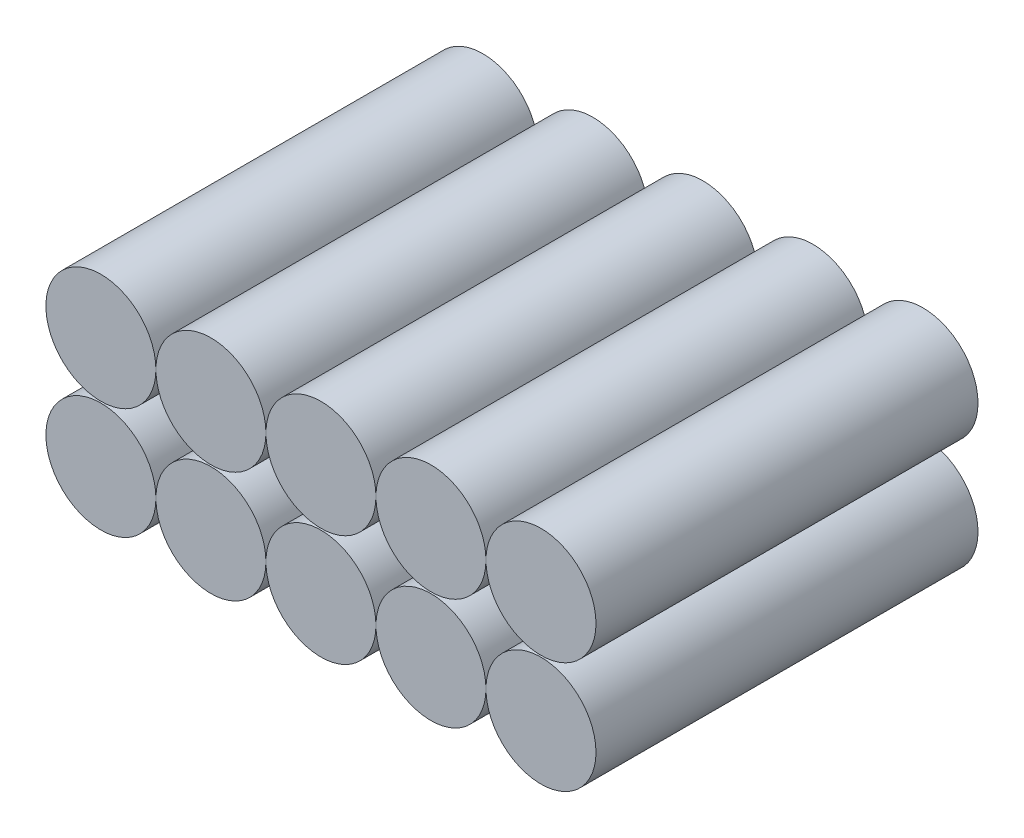
ISO-10303-21;
HEADER;
FILE_DESCRIPTION(('STEP AP214'),'2;1');
FILE_NAME('part.step','',(''),(''),'','','');
FILE_SCHEMA(('AUTOMOTIVE_DESIGN { 1 0 10303 214 1 1 1 1 }'));
ENDSEC;
DATA;
#1=APPLICATION_CONTEXT('core data for automotive mechanical design processes');
#2=APPLICATION_PROTOCOL_DEFINITION('international standard','automotive_design',2000,#1);
#3=PRODUCT_CONTEXT('',#1,'mechanical');
#4=PRODUCT('Part','Part','',(#3));
#5=PRODUCT_RELATED_PRODUCT_CATEGORY('part','',(#4));
#6=PRODUCT_DEFINITION_FORMATION('','',#4);
#7=PRODUCT_DEFINITION_CONTEXT('part definition',#1,'design');
#8=PRODUCT_DEFINITION('design','',#6,#7);
#9=PRODUCT_DEFINITION_SHAPE('','',#8);
#10=(LENGTH_UNIT() NAMED_UNIT(*) SI_UNIT(.MILLI.,.METRE.));
#11=(NAMED_UNIT(*) PLANE_ANGLE_UNIT() SI_UNIT($,.RADIAN.));
#12=(NAMED_UNIT(*) SI_UNIT($,.STERADIAN.) SOLID_ANGLE_UNIT());
#13=UNCERTAINTY_MEASURE_WITH_UNIT(LENGTH_MEASURE(1.E-05),#10,'distance_accuracy_value','');
#14=(GEOMETRIC_REPRESENTATION_CONTEXT(3) GLOBAL_UNCERTAINTY_ASSIGNED_CONTEXT((#13)) GLOBAL_UNIT_ASSIGNED_CONTEXT((#10,
#11,#12)) REPRESENTATION_CONTEXT('',''));
#15=CARTESIAN_POINT('',(0.,0.,0.));
#16=DIRECTION('',(0.,0.,1.));
#17=DIRECTION('',(1.,0.,0.));
#18=AXIS2_PLACEMENT_3D('',#15,#16,#17);
#19=CARTESIAN_POINT('',(57.6,14.6000000000008,-50.));
#20=DIRECTION('',(0.,0.,1.));
#21=DIRECTION('',(1.,0.,0.));
#22=AXIS2_PLACEMENT_3D('',#19,#20,#21);
#23=CYLINDRICAL_SURFACE('',#22,7.2);
#24=CARTESIAN_POINT('',(57.6,14.6000000000008,-50.));
#25=DIRECTION('',(0.,0.,1.));
#26=DIRECTION('',(1.,0.,0.));
#27=AXIS2_PLACEMENT_3D('',#24,#25,#26);
#28=CIRCLE('',#27,7.2);
#29=CARTESIAN_POINT('',(64.7999999999999,14.6000000000008,-50.));
#30=VERTEX_POINT('',#29);
#31=EDGE_CURVE('E12',#30,#30,#28,.T.);
#32=ORIENTED_EDGE('',*,*,#31,.T.);
#33=EDGE_LOOP('',(#32));
#34=FACE_BOUND('',#33,.T.);
#35=CARTESIAN_POINT('',(57.6,14.6000000000008,0.));
#36=DIRECTION('',(0.,0.,1.));
#37=DIRECTION('',(1.,0.,0.));
#38=AXIS2_PLACEMENT_3D('',#35,#36,#37);
#39=CIRCLE('',#38,7.2);
#40=CARTESIAN_POINT('',(64.7999999999999,14.6000000000008,0.));
#41=VERTEX_POINT('',#40);
#42=EDGE_CURVE('E74',#41,#41,#39,.T.);
#43=ORIENTED_EDGE('',*,*,#42,.F.);
#44=EDGE_LOOP('',(#43));
#45=FACE_BOUND('',#44,.T.);
#46=ADVANCED_FACE('F71',(#34,#45),#23,.T.);
#47=CARTESIAN_POINT('',(0.,0.,-50.));
#48=DIRECTION('',(0.,0.,1.));
#49=DIRECTION('',(1.,0.,0.));
#50=AXIS2_PLACEMENT_3D('',#47,#48,#49);
#51=PLANE('',#50);
#52=ORIENTED_EDGE('',*,*,#31,.F.);
#53=EDGE_LOOP('',(#52));
#54=FACE_BOUND('',#53,.T.);
#55=ADVANCED_FACE('F86',(#54),#51,.F.);
#56=CARTESIAN_POINT('',(0.,0.,0.));
#57=DIRECTION('',(0.,0.,1.));
#58=DIRECTION('',(1.,0.,0.));
#59=AXIS2_PLACEMENT_3D('',#56,#57,#58);
#60=PLANE('',#59);
#61=ORIENTED_EDGE('',*,*,#42,.T.);
#62=EDGE_LOOP('',(#61));
#63=FACE_BOUND('',#62,.T.);
#64=ADVANCED_FACE('F83',(#63),#60,.T.);
#65=CLOSED_SHELL('',(#46,#55,#64));
#66=MANIFOLD_SOLID_BREP('B2',#65);
#67=CARTESIAN_POINT('',(43.2,14.6000000000006,-50.));
#68=DIRECTION('',(0.,0.,1.));
#69=DIRECTION('',(1.,0.,0.));
#70=AXIS2_PLACEMENT_3D('',#67,#68,#69);
#71=CYLINDRICAL_SURFACE('',#70,7.2);
#72=CARTESIAN_POINT('',(43.2,14.6000000000006,-50.));
#73=DIRECTION('',(0.,0.,1.));
#74=DIRECTION('',(1.,0.,0.));
#75=AXIS2_PLACEMENT_3D('',#72,#73,#74);
#76=CIRCLE('',#75,7.2);
#77=CARTESIAN_POINT('',(50.3999999999999,14.6000000000006,-50.));
#78=VERTEX_POINT('',#77);
#79=EDGE_CURVE('E70',#78,#78,#76,.T.);
#80=ORIENTED_EDGE('',*,*,#79,.T.);
#81=EDGE_LOOP('',(#80));
#82=FACE_BOUND('',#81,.T.);
#83=CARTESIAN_POINT('',(43.2,14.6000000000006,0.));
#84=DIRECTION('',(0.,0.,1.));
#85=DIRECTION('',(1.,0.,0.));
#86=AXIS2_PLACEMENT_3D('',#83,#84,#85);
#87=CIRCLE('',#86,7.2);
#88=CARTESIAN_POINT('',(50.3999999999999,14.6000000000006,0.));
#89=VERTEX_POINT('',#88);
#90=EDGE_CURVE('E122',#89,#89,#87,.T.);
#91=ORIENTED_EDGE('',*,*,#90,.F.);
#92=EDGE_LOOP('',(#91));
#93=FACE_BOUND('',#92,.T.);
#94=ADVANCED_FACE('F119',(#82,#93),#71,.T.);
#95=CARTESIAN_POINT('',(0.,0.,-50.));
#96=DIRECTION('',(0.,0.,1.));
#97=DIRECTION('',(1.,0.,0.));
#98=AXIS2_PLACEMENT_3D('',#95,#96,#97);
#99=PLANE('',#98);
#100=ORIENTED_EDGE('',*,*,#79,.F.);
#101=EDGE_LOOP('',(#100));
#102=FACE_BOUND('',#101,.T.);
#103=ADVANCED_FACE('F134',(#102),#99,.F.);
#104=CARTESIAN_POINT('',(0.,0.,0.));
#105=DIRECTION('',(0.,0.,1.));
#106=DIRECTION('',(1.,0.,0.));
#107=AXIS2_PLACEMENT_3D('',#104,#105,#106);
#108=PLANE('',#107);
#109=ORIENTED_EDGE('',*,*,#90,.T.);
#110=EDGE_LOOP('',(#109));
#111=FACE_BOUND('',#110,.T.);
#112=ADVANCED_FACE('F131',(#111),#108,.T.);
#113=CLOSED_SHELL('',(#94,#103,#112));
#114=MANIFOLD_SOLID_BREP('B7',#113);
#115=CARTESIAN_POINT('',(28.7999999999999,14.6000000000004,-50.));
#116=DIRECTION('',(0.,0.,1.));
#117=DIRECTION('',(1.,0.,0.));
#118=AXIS2_PLACEMENT_3D('',#115,#116,#117);
#119=CYLINDRICAL_SURFACE('',#118,7.2);
#120=CARTESIAN_POINT('',(28.7999999999999,14.6000000000004,-50.));
#121=DIRECTION('',(0.,0.,1.));
#122=DIRECTION('',(1.,0.,0.));
#123=AXIS2_PLACEMENT_3D('',#120,#121,#122);
#124=CIRCLE('',#123,7.2);
#125=CARTESIAN_POINT('',(36.,14.6000000000004,-50.));
#126=VERTEX_POINT('',#125);
#127=EDGE_CURVE('E118',#126,#126,#124,.T.);
#128=ORIENTED_EDGE('',*,*,#127,.T.);
#129=EDGE_LOOP('',(#128));
#130=FACE_BOUND('',#129,.T.);
#131=CARTESIAN_POINT('',(28.7999999999999,14.6000000000004,0.));
#132=DIRECTION('',(0.,0.,1.));
#133=DIRECTION('',(1.,0.,0.));
#134=AXIS2_PLACEMENT_3D('',#131,#132,#133);
#135=CIRCLE('',#134,7.2);
#136=CARTESIAN_POINT('',(36.,14.6000000000004,0.));
#137=VERTEX_POINT('',#136);
#138=EDGE_CURVE('E170',#137,#137,#135,.T.);
#139=ORIENTED_EDGE('',*,*,#138,.F.);
#140=EDGE_LOOP('',(#139));
#141=FACE_BOUND('',#140,.T.);
#142=ADVANCED_FACE('F167',(#130,#141),#119,.T.);
#143=CARTESIAN_POINT('',(0.,0.,-50.));
#144=DIRECTION('',(0.,0.,1.));
#145=DIRECTION('',(1.,0.,0.));
#146=AXIS2_PLACEMENT_3D('',#143,#144,#145);
#147=PLANE('',#146);
#148=ORIENTED_EDGE('',*,*,#127,.F.);
#149=EDGE_LOOP('',(#148));
#150=FACE_BOUND('',#149,.T.);
#151=ADVANCED_FACE('F182',(#150),#147,.F.);
#152=CARTESIAN_POINT('',(0.,0.,0.));
#153=DIRECTION('',(0.,0.,1.));
#154=DIRECTION('',(1.,0.,0.));
#155=AXIS2_PLACEMENT_3D('',#152,#153,#154);
#156=PLANE('',#155);
#157=ORIENTED_EDGE('',*,*,#138,.T.);
#158=EDGE_LOOP('',(#157));
#159=FACE_BOUND('',#158,.T.);
#160=ADVANCED_FACE('F179',(#159),#156,.T.);
#161=CLOSED_SHELL('',(#142,#151,#160));
#162=MANIFOLD_SOLID_BREP('B65',#161);
#163=CARTESIAN_POINT('',(14.3999999999999,14.6000000000002,-50.));
#164=DIRECTION('',(0.,0.,1.));
#165=DIRECTION('',(1.,0.,0.));
#166=AXIS2_PLACEMENT_3D('',#163,#164,#165);
#167=CYLINDRICAL_SURFACE('',#166,7.2);
#168=CARTESIAN_POINT('',(14.3999999999999,14.6000000000002,-50.));
#169=DIRECTION('',(0.,0.,1.));
#170=DIRECTION('',(1.,0.,0.));
#171=AXIS2_PLACEMENT_3D('',#168,#169,#170);
#172=CIRCLE('',#171,7.2);
#173=CARTESIAN_POINT('',(21.5999999999999,14.6000000000002,-50.));
#174=VERTEX_POINT('',#173);
#175=EDGE_CURVE('E166',#174,#174,#172,.T.);
#176=ORIENTED_EDGE('',*,*,#175,.T.);
#177=EDGE_LOOP('',(#176));
#178=FACE_BOUND('',#177,.T.);
#179=CARTESIAN_POINT('',(14.3999999999999,14.6000000000002,0.));
#180=DIRECTION('',(0.,0.,1.));
#181=DIRECTION('',(1.,0.,0.));
#182=AXIS2_PLACEMENT_3D('',#179,#180,#181);
#183=CIRCLE('',#182,7.2);
#184=CARTESIAN_POINT('',(21.5999999999999,14.6000000000002,0.));
#185=VERTEX_POINT('',#184);
#186=EDGE_CURVE('E218',#185,#185,#183,.T.);
#187=ORIENTED_EDGE('',*,*,#186,.F.);
#188=EDGE_LOOP('',(#187));
#189=FACE_BOUND('',#188,.T.);
#190=ADVANCED_FACE('F215',(#178,#189),#167,.T.);
#191=CARTESIAN_POINT('',(0.,0.,-50.));
#192=DIRECTION('',(0.,0.,1.));
#193=DIRECTION('',(1.,0.,0.));
#194=AXIS2_PLACEMENT_3D('',#191,#192,#193);
#195=PLANE('',#194);
#196=ORIENTED_EDGE('',*,*,#175,.F.);
#197=EDGE_LOOP('',(#196));
#198=FACE_BOUND('',#197,.T.);
#199=ADVANCED_FACE('F230',(#198),#195,.F.);
#200=CARTESIAN_POINT('',(0.,0.,0.));
#201=DIRECTION('',(0.,0.,1.));
#202=DIRECTION('',(1.,0.,0.));
#203=AXIS2_PLACEMENT_3D('',#200,#201,#202);
#204=PLANE('',#203);
#205=ORIENTED_EDGE('',*,*,#186,.T.);
#206=EDGE_LOOP('',(#205));
#207=FACE_BOUND('',#206,.T.);
#208=ADVANCED_FACE('F227',(#207),#204,.T.);
#209=CLOSED_SHELL('',(#190,#199,#208));
#210=MANIFOLD_SOLID_BREP('B113',#209);
#211=CARTESIAN_POINT('',(0.,14.6,-50.));
#212=DIRECTION('',(0.,0.,1.));
#213=DIRECTION('',(1.,0.,0.));
#214=AXIS2_PLACEMENT_3D('',#211,#212,#213);
#215=CYLINDRICAL_SURFACE('',#214,7.2);
#216=CARTESIAN_POINT('',(0.,14.6,-50.));
#217=DIRECTION('',(0.,0.,1.));
#218=DIRECTION('',(1.,0.,0.));
#219=AXIS2_PLACEMENT_3D('',#216,#217,#218);
#220=CIRCLE('',#219,7.2);
#221=CARTESIAN_POINT('',(7.19999999999995,14.6,-50.));
#222=VERTEX_POINT('',#221);
#223=EDGE_CURVE('E214',#222,#222,#220,.T.);
#224=ORIENTED_EDGE('',*,*,#223,.T.);
#225=EDGE_LOOP('',(#224));
#226=FACE_BOUND('',#225,.T.);
#227=CARTESIAN_POINT('',(0.,14.6,0.));
#228=DIRECTION('',(0.,0.,1.));
#229=DIRECTION('',(1.,0.,0.));
#230=AXIS2_PLACEMENT_3D('',#227,#228,#229);
#231=CIRCLE('',#230,7.2);
#232=CARTESIAN_POINT('',(7.19999999999995,14.6,0.));
#233=VERTEX_POINT('',#232);
#234=EDGE_CURVE('E266',#233,#233,#231,.T.);
#235=ORIENTED_EDGE('',*,*,#234,.F.);
#236=EDGE_LOOP('',(#235));
#237=FACE_BOUND('',#236,.T.);
#238=ADVANCED_FACE('F263',(#226,#237),#215,.T.);
#239=CARTESIAN_POINT('',(0.,0.,-50.));
#240=DIRECTION('',(0.,0.,1.));
#241=DIRECTION('',(1.,0.,0.));
#242=AXIS2_PLACEMENT_3D('',#239,#240,#241);
#243=PLANE('',#242);
#244=ORIENTED_EDGE('',*,*,#223,.F.);
#245=EDGE_LOOP('',(#244));
#246=FACE_BOUND('',#245,.T.);
#247=ADVANCED_FACE('F278',(#246),#243,.F.);
#248=CARTESIAN_POINT('',(0.,0.,0.));
#249=DIRECTION('',(0.,0.,1.));
#250=DIRECTION('',(1.,0.,0.));
#251=AXIS2_PLACEMENT_3D('',#248,#249,#250);
#252=PLANE('',#251);
#253=ORIENTED_EDGE('',*,*,#234,.T.);
#254=EDGE_LOOP('',(#253));
#255=FACE_BOUND('',#254,.T.);
#256=ADVANCED_FACE('F275',(#255),#252,.T.);
#257=CLOSED_SHELL('',(#238,#247,#256));
#258=MANIFOLD_SOLID_BREP('B161',#257);
#259=CARTESIAN_POINT('',(57.6,8.04437300469458E-13,-50.));
#260=DIRECTION('',(0.,0.,1.));
#261=DIRECTION('',(1.,0.,0.));
#262=AXIS2_PLACEMENT_3D('',#259,#260,#261);
#263=CYLINDRICAL_SURFACE('',#262,7.2);
#264=CARTESIAN_POINT('',(57.6,8.04437300469458E-13,-50.));
#265=DIRECTION('',(0.,0.,1.));
#266=DIRECTION('',(1.,0.,0.));
#267=AXIS2_PLACEMENT_3D('',#264,#265,#266);
#268=CIRCLE('',#267,7.2);
#269=CARTESIAN_POINT('',(64.8,8.04437300469458E-13,-50.));
#270=VERTEX_POINT('',#269);
#271=EDGE_CURVE('E262',#270,#270,#268,.T.);
#272=ORIENTED_EDGE('',*,*,#271,.T.);
#273=EDGE_LOOP('',(#272));
#274=FACE_BOUND('',#273,.T.);
#275=CARTESIAN_POINT('',(57.6,8.04437300469458E-13,0.));
#276=DIRECTION('',(0.,0.,1.));
#277=DIRECTION('',(1.,0.,0.));
#278=AXIS2_PLACEMENT_3D('',#275,#276,#277);
#279=CIRCLE('',#278,7.2);
#280=CARTESIAN_POINT('',(64.8,8.04437300469458E-13,0.));
#281=VERTEX_POINT('',#280);
#282=EDGE_CURVE('E314',#281,#281,#279,.T.);
#283=ORIENTED_EDGE('',*,*,#282,.F.);
#284=EDGE_LOOP('',(#283));
#285=FACE_BOUND('',#284,.T.);
#286=ADVANCED_FACE('F311',(#274,#285),#263,.T.);
#287=CARTESIAN_POINT('',(0.,0.,-50.));
#288=DIRECTION('',(0.,0.,1.));
#289=DIRECTION('',(1.,0.,0.));
#290=AXIS2_PLACEMENT_3D('',#287,#288,#289);
#291=PLANE('',#290);
#292=ORIENTED_EDGE('',*,*,#271,.F.);
#293=EDGE_LOOP('',(#292));
#294=FACE_BOUND('',#293,.T.);
#295=ADVANCED_FACE('F326',(#294),#291,.F.);
#296=CARTESIAN_POINT('',(0.,0.,0.));
#297=DIRECTION('',(0.,0.,1.));
#298=DIRECTION('',(1.,0.,0.));
#299=AXIS2_PLACEMENT_3D('',#296,#297,#298);
#300=PLANE('',#299);
#301=ORIENTED_EDGE('',*,*,#282,.T.);
#302=EDGE_LOOP('',(#301));
#303=FACE_BOUND('',#302,.T.);
#304=ADVANCED_FACE('F323',(#303),#300,.T.);
#305=CLOSED_SHELL('',(#286,#295,#304));
#306=MANIFOLD_SOLID_BREP('B209',#305);
#307=CARTESIAN_POINT('',(43.2,6.03327975352093E-13,-50.));
#308=DIRECTION('',(0.,0.,1.));
#309=DIRECTION('',(1.,0.,0.));
#310=AXIS2_PLACEMENT_3D('',#307,#308,#309);
#311=CYLINDRICAL_SURFACE('',#310,7.2);
#312=CARTESIAN_POINT('',(43.2,6.03327975352093E-13,-50.));
#313=DIRECTION('',(0.,0.,1.));
#314=DIRECTION('',(1.,0.,0.));
#315=AXIS2_PLACEMENT_3D('',#312,#313,#314);
#316=CIRCLE('',#315,7.2);
#317=CARTESIAN_POINT('',(50.4,6.03327975352093E-13,-50.));
#318=VERTEX_POINT('',#317);
#319=EDGE_CURVE('E310',#318,#318,#316,.T.);
#320=ORIENTED_EDGE('',*,*,#319,.T.);
#321=EDGE_LOOP('',(#320));
#322=FACE_BOUND('',#321,.T.);
#323=CARTESIAN_POINT('',(43.2,6.03327975352093E-13,0.));
#324=DIRECTION('',(0.,0.,1.));
#325=DIRECTION('',(1.,0.,0.));
#326=AXIS2_PLACEMENT_3D('',#323,#324,#325);
#327=CIRCLE('',#326,7.2);
#328=CARTESIAN_POINT('',(50.4,6.03327975352093E-13,0.));
#329=VERTEX_POINT('',#328);
#330=EDGE_CURVE('E362',#329,#329,#327,.T.);
#331=ORIENTED_EDGE('',*,*,#330,.F.);
#332=EDGE_LOOP('',(#331));
#333=FACE_BOUND('',#332,.T.);
#334=ADVANCED_FACE('F359',(#322,#333),#311,.T.);
#335=CARTESIAN_POINT('',(0.,0.,-50.));
#336=DIRECTION('',(0.,0.,1.));
#337=DIRECTION('',(1.,0.,0.));
#338=AXIS2_PLACEMENT_3D('',#335,#336,#337);
#339=PLANE('',#338);
#340=ORIENTED_EDGE('',*,*,#319,.F.);
#341=EDGE_LOOP('',(#340));
#342=FACE_BOUND('',#341,.T.);
#343=ADVANCED_FACE('F374',(#342),#339,.F.);
#344=CARTESIAN_POINT('',(0.,0.,0.));
#345=DIRECTION('',(0.,0.,1.));
#346=DIRECTION('',(1.,0.,0.));
#347=AXIS2_PLACEMENT_3D('',#344,#345,#346);
#348=PLANE('',#347);
#349=ORIENTED_EDGE('',*,*,#330,.T.);
#350=EDGE_LOOP('',(#349));
#351=FACE_BOUND('',#350,.T.);
#352=ADVANCED_FACE('F371',(#351),#348,.T.);
#353=CLOSED_SHELL('',(#334,#343,#352));
#354=MANIFOLD_SOLID_BREP('B257',#353);
#355=CARTESIAN_POINT('',(14.4,2.01109325117364E-13,-50.));
#356=DIRECTION('',(0.,0.,1.));
#357=DIRECTION('',(1.,0.,0.));
#358=AXIS2_PLACEMENT_3D('',#355,#356,#357);
#359=CYLINDRICAL_SURFACE('',#358,7.2);
#360=CARTESIAN_POINT('',(14.4,2.01109325117364E-13,-50.));
#361=DIRECTION('',(0.,0.,1.));
#362=DIRECTION('',(1.,0.,0.));
#363=AXIS2_PLACEMENT_3D('',#360,#361,#362);
#364=CIRCLE('',#363,7.2);
#365=CARTESIAN_POINT('',(21.6,2.01109325117364E-13,-50.));
#366=VERTEX_POINT('',#365);
#367=EDGE_CURVE('E358',#366,#366,#364,.T.);
#368=ORIENTED_EDGE('',*,*,#367,.T.);
#369=EDGE_LOOP('',(#368));
#370=FACE_BOUND('',#369,.T.);
#371=CARTESIAN_POINT('',(14.4,2.01109325117364E-13,0.));
#372=DIRECTION('',(0.,0.,1.));
#373=DIRECTION('',(1.,0.,0.));
#374=AXIS2_PLACEMENT_3D('',#371,#372,#373);
#375=CIRCLE('',#374,7.2);
#376=CARTESIAN_POINT('',(21.6,2.01109325117364E-13,0.));
#377=VERTEX_POINT('',#376);
#378=EDGE_CURVE('E410',#377,#377,#375,.T.);
#379=ORIENTED_EDGE('',*,*,#378,.F.);
#380=EDGE_LOOP('',(#379));
#381=FACE_BOUND('',#380,.T.);
#382=ADVANCED_FACE('F407',(#370,#381),#359,.T.);
#383=CARTESIAN_POINT('',(0.,0.,-50.));
#384=DIRECTION('',(0.,0.,1.));
#385=DIRECTION('',(1.,0.,0.));
#386=AXIS2_PLACEMENT_3D('',#383,#384,#385);
#387=PLANE('',#386);
#388=ORIENTED_EDGE('',*,*,#367,.F.);
#389=EDGE_LOOP('',(#388));
#390=FACE_BOUND('',#389,.T.);
#391=ADVANCED_FACE('F422',(#390),#387,.F.);
#392=CARTESIAN_POINT('',(0.,0.,0.));
#393=DIRECTION('',(0.,0.,1.));
#394=DIRECTION('',(1.,0.,0.));
#395=AXIS2_PLACEMENT_3D('',#392,#393,#394);
#396=PLANE('',#395);
#397=ORIENTED_EDGE('',*,*,#378,.T.);
#398=EDGE_LOOP('',(#397));
#399=FACE_BOUND('',#398,.T.);
#400=ADVANCED_FACE('F419',(#399),#396,.T.);
#401=CLOSED_SHELL('',(#382,#391,#400));
#402=MANIFOLD_SOLID_BREP('B305',#401);
#403=CARTESIAN_POINT('',(28.8,4.02218650234729E-13,-50.));
#404=DIRECTION('',(0.,0.,1.));
#405=DIRECTION('',(1.,0.,0.));
#406=AXIS2_PLACEMENT_3D('',#403,#404,#405);
#407=CYLINDRICAL_SURFACE('',#406,7.2);
#408=CARTESIAN_POINT('',(28.8,4.02218650234729E-13,-50.));
#409=DIRECTION('',(0.,0.,1.));
#410=DIRECTION('',(1.,0.,0.));
#411=AXIS2_PLACEMENT_3D('',#408,#409,#410);
#412=CIRCLE('',#411,7.2);
#413=CARTESIAN_POINT('',(36.,4.02218650234729E-13,-50.));
#414=VERTEX_POINT('',#413);
#415=EDGE_CURVE('E406',#414,#414,#412,.T.);
#416=ORIENTED_EDGE('',*,*,#415,.T.);
#417=EDGE_LOOP('',(#416));
#418=FACE_BOUND('',#417,.T.);
#419=CARTESIAN_POINT('',(28.8,4.02218650234729E-13,0.));
#420=DIRECTION('',(0.,0.,1.));
#421=DIRECTION('',(1.,0.,0.));
#422=AXIS2_PLACEMENT_3D('',#419,#420,#421);
#423=CIRCLE('',#422,7.2);
#424=CARTESIAN_POINT('',(36.,4.02218650234729E-13,0.));
#425=VERTEX_POINT('',#424);
#426=EDGE_CURVE('E457',#425,#425,#423,.T.);
#427=ORIENTED_EDGE('',*,*,#426,.F.);
#428=EDGE_LOOP('',(#427));
#429=FACE_BOUND('',#428,.T.);
#430=ADVANCED_FACE('F454',(#418,#429),#407,.T.);
#431=CARTESIAN_POINT('',(0.,0.,-50.));
#432=DIRECTION('',(0.,0.,1.));
#433=DIRECTION('',(1.,0.,0.));
#434=AXIS2_PLACEMENT_3D('',#431,#432,#433);
#435=PLANE('',#434);
#436=ORIENTED_EDGE('',*,*,#415,.F.);
#437=EDGE_LOOP('',(#436));
#438=FACE_BOUND('',#437,.T.);
#439=ADVANCED_FACE('F469',(#438),#435,.F.);
#440=CARTESIAN_POINT('',(0.,0.,0.));
#441=DIRECTION('',(0.,0.,1.));
#442=DIRECTION('',(1.,0.,0.));
#443=AXIS2_PLACEMENT_3D('',#440,#441,#442);
#444=PLANE('',#443);
#445=ORIENTED_EDGE('',*,*,#426,.T.);
#446=EDGE_LOOP('',(#445));
#447=FACE_BOUND('',#446,.T.);
#448=ADVANCED_FACE('F466',(#447),#444,.T.);
#449=CLOSED_SHELL('',(#430,#439,#448));
#450=MANIFOLD_SOLID_BREP('B353',#449);
#451=CARTESIAN_POINT('',(0.,0.,-50.));
#452=DIRECTION('',(0.,0.,1.));
#453=DIRECTION('',(1.,0.,0.));
#454=AXIS2_PLACEMENT_3D('',#451,#452,#453);
#455=CYLINDRICAL_SURFACE('',#454,7.2);
#456=CARTESIAN_POINT('',(0.,0.,-50.));
#457=DIRECTION('',(0.,0.,1.));
#458=DIRECTION('',(1.,0.,0.));
#459=AXIS2_PLACEMENT_3D('',#456,#457,#458);
#460=CIRCLE('',#459,7.2);
#461=CARTESIAN_POINT('',(7.2,0.,-50.));
#462=VERTEX_POINT('',#461);
#463=EDGE_CURVE('E453',#462,#462,#460,.T.);
#464=ORIENTED_EDGE('',*,*,#463,.T.);
#465=EDGE_LOOP('',(#464));
#466=FACE_BOUND('',#465,.T.);
#467=CARTESIAN_POINT('',(0.,0.,0.));
#468=DIRECTION('',(0.,0.,1.));
#469=DIRECTION('',(1.,0.,0.));
#470=AXIS2_PLACEMENT_3D('',#467,#468,#469);
#471=CIRCLE('',#470,7.2);
#472=CARTESIAN_POINT('',(7.2,0.,0.));
#473=VERTEX_POINT('',#472);
#474=EDGE_CURVE('E497',#473,#473,#471,.T.);
#475=ORIENTED_EDGE('',*,*,#474,.F.);
#476=EDGE_LOOP('',(#475));
#477=FACE_BOUND('',#476,.T.);
#478=ADVANCED_FACE('F494',(#466,#477),#455,.T.);
#479=CARTESIAN_POINT('',(0.,0.,-50.));
#480=DIRECTION('',(0.,0.,1.));
#481=DIRECTION('',(1.,0.,0.));
#482=AXIS2_PLACEMENT_3D('',#479,#480,#481);
#483=PLANE('',#482);
#484=ORIENTED_EDGE('',*,*,#463,.F.);
#485=EDGE_LOOP('',(#484));
#486=FACE_BOUND('',#485,.T.);
#487=ADVANCED_FACE('F509',(#486),#483,.F.);
#488=CARTESIAN_POINT('',(0.,0.,0.));
#489=DIRECTION('',(0.,0.,1.));
#490=DIRECTION('',(1.,0.,0.));
#491=AXIS2_PLACEMENT_3D('',#488,#489,#490);
#492=PLANE('',#491);
#493=ORIENTED_EDGE('',*,*,#474,.T.);
#494=EDGE_LOOP('',(#493));
#495=FACE_BOUND('',#494,.T.);
#496=ADVANCED_FACE('F506',(#495),#492,.T.);
#497=CLOSED_SHELL('',(#478,#487,#496));
#498=MANIFOLD_SOLID_BREP('B401',#497);
#499=ADVANCED_BREP_SHAPE_REPRESENTATION('',(#18,#66,#114,#162,#210,#258,#306,#354,#402,#450,
#498),#14);
#500=SHAPE_DEFINITION_REPRESENTATION(#9,#499);
ENDSEC;
END-ISO-10303-21;
